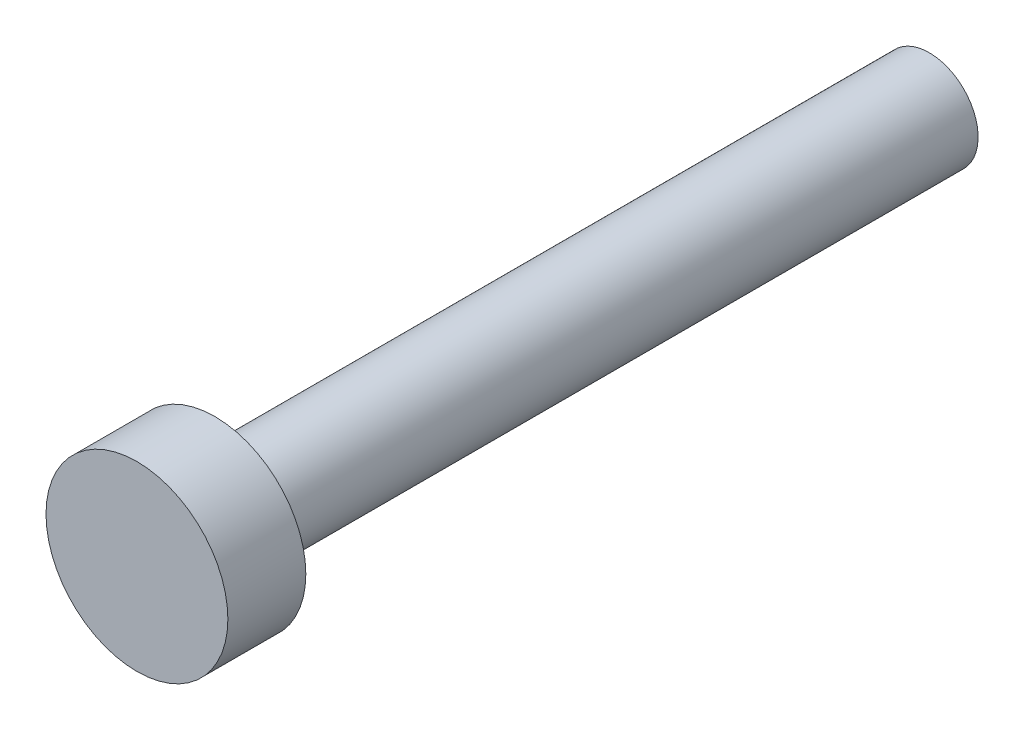
ISO-10303-21;
HEADER;
FILE_DESCRIPTION(('STEP AP214'),'2;1');
FILE_NAME('part.step','',(''),(''),'','','');
FILE_SCHEMA(('AUTOMOTIVE_DESIGN { 1 0 10303 214 1 1 1 1 }'));
ENDSEC;
DATA;
#1=APPLICATION_CONTEXT('core data for automotive mechanical design processes');
#2=APPLICATION_PROTOCOL_DEFINITION('international standard','automotive_design',2000,#1);
#3=PRODUCT_CONTEXT('',#1,'mechanical');
#4=PRODUCT('Part','Part','',(#3));
#5=PRODUCT_RELATED_PRODUCT_CATEGORY('part','',(#4));
#6=PRODUCT_DEFINITION_FORMATION('','',#4);
#7=PRODUCT_DEFINITION_CONTEXT('part definition',#1,'design');
#8=PRODUCT_DEFINITION('design','',#6,#7);
#9=PRODUCT_DEFINITION_SHAPE('','',#8);
#10=(LENGTH_UNIT() NAMED_UNIT(*) SI_UNIT(.MILLI.,.METRE.));
#11=(NAMED_UNIT(*) PLANE_ANGLE_UNIT() SI_UNIT($,.RADIAN.));
#12=(NAMED_UNIT(*) SI_UNIT($,.STERADIAN.) SOLID_ANGLE_UNIT());
#13=UNCERTAINTY_MEASURE_WITH_UNIT(LENGTH_MEASURE(1.E-05),#10,'distance_accuracy_value','');
#14=(GEOMETRIC_REPRESENTATION_CONTEXT(3) GLOBAL_UNCERTAINTY_ASSIGNED_CONTEXT((#13)) GLOBAL_UNIT_ASSIGNED_CONTEXT((#10,
#11,#12)) REPRESENTATION_CONTEXT('',''));
#15=CARTESIAN_POINT('',(0.,0.,0.));
#16=DIRECTION('',(0.,0.,1.));
#17=DIRECTION('',(1.,0.,0.));
#18=AXIS2_PLACEMENT_3D('',#15,#16,#17);
#19=CARTESIAN_POINT('',(0.,0.,2.4));
#20=DIRECTION('',(0.,0.,-1.));
#21=DIRECTION('',(-1.,0.,0.));
#22=AXIS2_PLACEMENT_3D('',#19,#20,#21);
#23=CYLINDRICAL_SURFACE('',#22,2.8);
#24=CARTESIAN_POINT('',(0.,0.,2.4));
#25=DIRECTION('',(0.,0.,1.));
#26=DIRECTION('',(1.,0.,0.));
#27=AXIS2_PLACEMENT_3D('',#24,#25,#26);
#28=CIRCLE('',#27,2.8);
#29=CARTESIAN_POINT('',(2.8,0.,2.4));
#30=VERTEX_POINT('',#29);
#31=EDGE_CURVE('E40',#30,#30,#28,.T.);
#32=ORIENTED_EDGE('',*,*,#31,.F.);
#33=EDGE_LOOP('',(#32));
#34=FACE_BOUND('',#33,.T.);
#35=CARTESIAN_POINT('',(0.,0.,0.));
#36=DIRECTION('',(0.,0.,1.));
#37=DIRECTION('',(1.,0.,0.));
#38=AXIS2_PLACEMENT_3D('',#35,#36,#37);
#39=CIRCLE('',#38,2.8);
#40=CARTESIAN_POINT('',(2.8,0.,0.));
#41=VERTEX_POINT('',#40);
#42=EDGE_CURVE('E36',#41,#41,#39,.T.);
#43=ORIENTED_EDGE('',*,*,#42,.T.);
#44=EDGE_LOOP('',(#43));
#45=FACE_BOUND('',#44,.T.);
#46=ADVANCED_FACE('F33',(#34,#45),#23,.T.);
#47=CARTESIAN_POINT('',(0.,0.,2.4));
#48=DIRECTION('',(0.,0.,1.));
#49=DIRECTION('',(1.,0.,0.));
#50=AXIS2_PLACEMENT_3D('',#47,#48,#49);
#51=PLANE('',#50);
#52=ORIENTED_EDGE('',*,*,#31,.T.);
#53=EDGE_LOOP('',(#52));
#54=FACE_BOUND('',#53,.T.);
#55=ADVANCED_FACE('F57',(#54),#51,.T.);
#56=CARTESIAN_POINT('',(0.,0.,0.));
#57=DIRECTION('',(0.,0.,1.));
#58=DIRECTION('',(1.,0.,0.));
#59=AXIS2_PLACEMENT_3D('',#56,#57,#58);
#60=PLANE('',#59);
#61=CARTESIAN_POINT('',(0.,0.,0.));
#62=DIRECTION('',(0.,0.,-1.));
#63=DIRECTION('',(-1.,0.,0.));
#64=AXIS2_PLACEMENT_3D('',#61,#62,#63);
#65=CIRCLE('',#64,1.5);
#66=CARTESIAN_POINT('',(-1.5,0.,0.));
#67=VERTEX_POINT('',#66);
#68=EDGE_CURVE('E10',#67,#67,#65,.T.);
#69=ORIENTED_EDGE('',*,*,#68,.F.);
#70=EDGE_LOOP('',(#69));
#71=FACE_BOUND('',#70,.T.);
#72=ORIENTED_EDGE('',*,*,#42,.F.);
#73=EDGE_LOOP('',(#72));
#74=FACE_BOUND('',#73,.T.);
#75=ADVANCED_FACE('F54',(#71,#74),#60,.F.);
#76=CARTESIAN_POINT('',(0.,0.,-22.));
#77=DIRECTION('',(0.,0.,1.));
#78=DIRECTION('',(1.,0.,0.));
#79=AXIS2_PLACEMENT_3D('',#76,#77,#78);
#80=CYLINDRICAL_SURFACE('',#79,1.5);
#81=CARTESIAN_POINT('',(0.,0.,-22.));
#82=DIRECTION('',(0.,0.,-1.));
#83=DIRECTION('',(-1.,0.,0.));
#84=AXIS2_PLACEMENT_3D('',#81,#82,#83);
#85=CIRCLE('',#84,1.5);
#86=CARTESIAN_POINT('',(-1.5,0.,-22.));
#87=VERTEX_POINT('',#86);
#88=EDGE_CURVE('E46',#87,#87,#85,.T.);
#89=ORIENTED_EDGE('',*,*,#88,.F.);
#90=EDGE_LOOP('',(#89));
#91=FACE_BOUND('',#90,.T.);
#92=ORIENTED_EDGE('',*,*,#68,.T.);
#93=EDGE_LOOP('',(#92));
#94=FACE_BOUND('',#93,.T.);
#95=ADVANCED_FACE('F56',(#91,#94),#80,.T.);
#96=CARTESIAN_POINT('',(0.,0.,-22.));
#97=DIRECTION('',(0.,0.,-1.));
#98=DIRECTION('',(-1.,0.,0.));
#99=AXIS2_PLACEMENT_3D('',#96,#97,#98);
#100=PLANE('',#99);
#101=ORIENTED_EDGE('',*,*,#88,.T.);
#102=EDGE_LOOP('',(#101));
#103=FACE_BOUND('',#102,.T.);
#104=ADVANCED_FACE('F63',(#103),#100,.T.);
#105=CLOSED_SHELL('',(#46,#55,#75,#95,#104));
#106=MANIFOLD_SOLID_BREP('B2',#105);
#107=ADVANCED_BREP_SHAPE_REPRESENTATION('',(#18,#106),#14);
#108=SHAPE_DEFINITION_REPRESENTATION(#9,#107);
ENDSEC;
END-ISO-10303-21;
